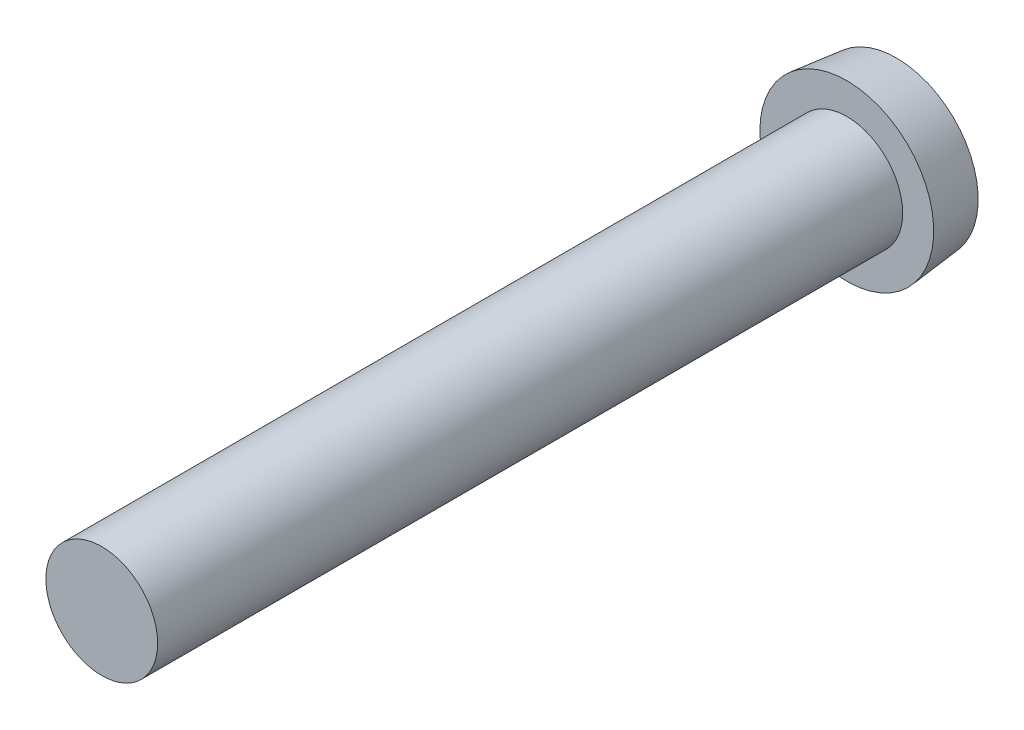
ISO-10303-21;
HEADER;
FILE_DESCRIPTION(('STEP AP214'),'2;1');
FILE_NAME('part.step','',(''),(''),'','','');
FILE_SCHEMA(('AUTOMOTIVE_DESIGN { 1 0 10303 214 1 1 1 1 }'));
ENDSEC;
DATA;
#1=APPLICATION_CONTEXT('core data for automotive mechanical design processes');
#2=APPLICATION_PROTOCOL_DEFINITION('international standard','automotive_design',2000,#1);
#3=PRODUCT_CONTEXT('',#1,'mechanical');
#4=PRODUCT('Part','Part','',(#3));
#5=PRODUCT_RELATED_PRODUCT_CATEGORY('part','',(#4));
#6=PRODUCT_DEFINITION_FORMATION('','',#4);
#7=PRODUCT_DEFINITION_CONTEXT('part definition',#1,'design');
#8=PRODUCT_DEFINITION('design','',#6,#7);
#9=PRODUCT_DEFINITION_SHAPE('','',#8);
#10=(LENGTH_UNIT() NAMED_UNIT(*) SI_UNIT(.MILLI.,.METRE.));
#11=(NAMED_UNIT(*) PLANE_ANGLE_UNIT() SI_UNIT($,.RADIAN.));
#12=(NAMED_UNIT(*) SI_UNIT($,.STERADIAN.) SOLID_ANGLE_UNIT());
#13=UNCERTAINTY_MEASURE_WITH_UNIT(LENGTH_MEASURE(1.E-05),#10,'distance_accuracy_value','');
#14=(GEOMETRIC_REPRESENTATION_CONTEXT(3) GLOBAL_UNCERTAINTY_ASSIGNED_CONTEXT((#13)) GLOBAL_UNIT_ASSIGNED_CONTEXT((#10,
#11,#12)) REPRESENTATION_CONTEXT('',''));
#15=CARTESIAN_POINT('',(0.,0.,0.));
#16=DIRECTION('',(0.,0.,1.));
#17=DIRECTION('',(1.,0.,0.));
#18=AXIS2_PLACEMENT_3D('',#15,#16,#17);
#19=CARTESIAN_POINT('',(0.,0.,30.));
#20=DIRECTION('',(0.,0.,-1.));
#21=DIRECTION('',(-1.,0.,0.));
#22=AXIS2_PLACEMENT_3D('',#19,#20,#21);
#23=CYLINDRICAL_SURFACE('',#22,2.25);
#24=CARTESIAN_POINT('',(0.,0.,30.));
#25=DIRECTION('',(0.,0.,1.));
#26=DIRECTION('',(1.,0.,0.));
#27=AXIS2_PLACEMENT_3D('',#24,#25,#26);
#28=CIRCLE('',#27,2.25);
#29=CARTESIAN_POINT('',(2.25,0.,30.));
#30=VERTEX_POINT('',#29);
#31=EDGE_CURVE('E11',#30,#30,#28,.T.);
#32=ORIENTED_EDGE('',*,*,#31,.F.);
#33=EDGE_LOOP('',(#32));
#34=FACE_BOUND('',#33,.T.);
#35=CARTESIAN_POINT('',(0.,0.,0.));
#36=DIRECTION('',(0.,0.,1.));
#37=DIRECTION('',(1.,0.,0.));
#38=AXIS2_PLACEMENT_3D('',#35,#36,#37);
#39=CIRCLE('',#38,2.25);
#40=CARTESIAN_POINT('',(2.25,0.,0.));
#41=VERTEX_POINT('',#40);
#42=EDGE_CURVE('E35',#41,#41,#39,.T.);
#43=ORIENTED_EDGE('',*,*,#42,.T.);
#44=EDGE_LOOP('',(#43));
#45=FACE_BOUND('',#44,.T.);
#46=ADVANCED_FACE('F32',(#34,#45),#23,.T.);
#47=CARTESIAN_POINT('',(0.,0.,30.));
#48=DIRECTION('',(0.,0.,1.));
#49=DIRECTION('',(1.,0.,0.));
#50=AXIS2_PLACEMENT_3D('',#47,#48,#49);
#51=PLANE('',#50);
#52=ORIENTED_EDGE('',*,*,#31,.T.);
#53=EDGE_LOOP('',(#52));
#54=FACE_BOUND('',#53,.T.);
#55=ADVANCED_FACE('F313',(#54),#51,.T.);
#56=CARTESIAN_POINT('',(0.,0.,0.));
#57=DIRECTION('',(0.,0.,1.));
#58=DIRECTION('',(-1.,0.,0.));
#59=AXIS2_PLACEMENT_3D('',#56,#57,#58);
#60=CONICAL_SURFACE('',#59,3.5,0.10471975511966);
#61=CARTESIAN_POINT('',(0.,0.,-2.));
#62=DIRECTION('',(0.,0.,-1.));
#63=DIRECTION('',(-1.,0.,0.));
#64=AXIS2_PLACEMENT_3D('',#61,#62,#63);
#65=CIRCLE('',#64,3.28979152946865);
#66=CARTESIAN_POINT('',(-3.28979152946865,0.,-2.));
#67=VERTEX_POINT('',#66);
#68=EDGE_CURVE('E295',#67,#67,#65,.T.);
#69=ORIENTED_EDGE('',*,*,#68,.F.);
#70=EDGE_LOOP('',(#69));
#71=FACE_BOUND('',#70,.T.);
#72=CARTESIAN_POINT('',(0.,0.,0.));
#73=DIRECTION('',(0.,0.,-1.));
#74=DIRECTION('',(-1.,0.,0.));
#75=AXIS2_PLACEMENT_3D('',#72,#73,#74);
#76=CIRCLE('',#75,3.5);
#77=CARTESIAN_POINT('',(-3.5,0.,0.));
#78=VERTEX_POINT('',#77);
#79=EDGE_CURVE('E259',#78,#78,#76,.T.);
#80=ORIENTED_EDGE('',*,*,#79,.T.);
#81=EDGE_LOOP('',(#80));
#82=FACE_BOUND('',#81,.T.);
#83=ADVANCED_FACE('F311',(#71,#82),#60,.T.);
#84=CARTESIAN_POINT('',(0.,0.,-2.));
#85=DIRECTION('',(0.,0.,-1.));
#86=DIRECTION('',(-1.,0.,0.));
#87=AXIS2_PLACEMENT_3D('',#84,#85,#86);
#88=PLANE('',#87);
#89=CARTESIAN_POINT('',(1.72197359249135,-0.2,-2.));
#90=DIRECTION('',(0.,0.,-1.));
#91=DIRECTION('',(-1.,0.,0.));
#92=AXIS2_PLACEMENT_3D('',#89,#90,#91);
#93=CIRCLE('',#92,0.2);
#94=CARTESIAN_POINT('',(1.92197359249135,-0.199999999999998,-2.));
#95=VERTEX_POINT('',#94);
#96=CARTESIAN_POINT('',(1.72197359249135,-0.4,-2.));
#97=VERTEX_POINT('',#96);
#98=EDGE_CURVE('E46',#95,#97,#93,.T.);
#99=ORIENTED_EDGE('',*,*,#98,.F.);
#100=DIRECTION('',(0.,-1.,0.));
#101=VECTOR('',#100,1.);
#102=CARTESIAN_POINT('',(1.92197359249135,0.199999999999999,-2.));
#103=LINE('',#102,#101);
#104=CARTESIAN_POINT('',(1.92197359249135,0.199999999999999,-2.));
#105=VERTEX_POINT('',#104);
#106=EDGE_CURVE('E255',#105,#95,#103,.T.);
#107=ORIENTED_EDGE('',*,*,#106,.F.);
#108=CARTESIAN_POINT('',(1.72197359249135,0.2,-2.));
#109=DIRECTION('',(0.,0.,-1.));
#110=DIRECTION('',(-1.,0.,0.));
#111=AXIS2_PLACEMENT_3D('',#108,#109,#110);
#112=CIRCLE('',#111,0.2);
#113=CARTESIAN_POINT('',(1.72197359249135,0.4,-2.));
#114=VERTEX_POINT('',#113);
#115=EDGE_CURVE('E253',#114,#105,#112,.T.);
#116=ORIENTED_EDGE('',*,*,#115,.F.);
#117=DIRECTION('',(1.,0.,0.));
#118=VECTOR('',#117,1.);
#119=CARTESIAN_POINT('',(1.72197359249135,0.4,-2.));
#120=LINE('',#119,#118);
#121=CARTESIAN_POINT('',(0.4,0.4,-2.));
#122=VERTEX_POINT('',#121);
#123=EDGE_CURVE('E178',#122,#114,#120,.T.);
#124=ORIENTED_EDGE('',*,*,#123,.F.);
#125=DIRECTION('',(0.,-1.,0.));
#126=VECTOR('',#125,1.);
#127=CARTESIAN_POINT('',(0.4,0.4,-2.));
#128=LINE('',#127,#126);
#129=CARTESIAN_POINT('',(0.4,3.06538333237671,-2.));
#130=VERTEX_POINT('',#129);
#131=EDGE_CURVE('E249',#130,#122,#128,.T.);
#132=ORIENTED_EDGE('',*,*,#131,.F.);
#133=CARTESIAN_POINT('',(0.2,3.06538333237671,-2.));
#134=DIRECTION('',(0.,0.,-1.));
#135=DIRECTION('',(-1.,0.,0.));
#136=AXIS2_PLACEMENT_3D('',#133,#134,#135);
#137=CIRCLE('',#136,0.2);
#138=CARTESIAN_POINT('',(0.199999999999999,3.26538333237671,-2.));
#139=VERTEX_POINT('',#138);
#140=EDGE_CURVE('E246',#139,#130,#137,.T.);
#141=ORIENTED_EDGE('',*,*,#140,.F.);
#142=DIRECTION('',(1.,0.,0.));
#143=VECTOR('',#142,1.);
#144=CARTESIAN_POINT('',(-0.199999999999999,3.26538333237671,-2.));
#145=LINE('',#144,#143);
#146=CARTESIAN_POINT('',(-0.199999999999999,3.26538333237671,-2.));
#147=VERTEX_POINT('',#146);
#148=EDGE_CURVE('E243',#147,#139,#145,.T.);
#149=ORIENTED_EDGE('',*,*,#148,.F.);
#150=CARTESIAN_POINT('',(-0.2,3.06538333237671,-2.));
#151=DIRECTION('',(0.,0.,-1.));
#152=DIRECTION('',(-1.,0.,0.));
#153=AXIS2_PLACEMENT_3D('',#150,#151,#152);
#154=CIRCLE('',#153,0.2);
#155=CARTESIAN_POINT('',(-0.4,3.06538333237671,-2.));
#156=VERTEX_POINT('',#155);
#157=EDGE_CURVE('E240',#156,#147,#154,.T.);
#158=ORIENTED_EDGE('',*,*,#157,.F.);
#159=DIRECTION('',(0.,1.,0.));
#160=VECTOR('',#159,1.);
#161=CARTESIAN_POINT('',(-0.4,0.4,-2.));
#162=LINE('',#161,#160);
#163=CARTESIAN_POINT('',(-0.4,0.4,-2.));
#164=VERTEX_POINT('',#163);
#165=EDGE_CURVE('E237',#164,#156,#162,.T.);
#166=ORIENTED_EDGE('',*,*,#165,.F.);
#167=DIRECTION('',(1.,0.,0.));
#168=VECTOR('',#167,1.);
#169=CARTESIAN_POINT('',(-0.4,0.4,-2.));
#170=LINE('',#169,#168);
#171=CARTESIAN_POINT('',(-1.72197359249135,0.4,-2.));
#172=VERTEX_POINT('',#171);
#173=EDGE_CURVE('E234',#172,#164,#170,.T.);
#174=ORIENTED_EDGE('',*,*,#173,.F.);
#175=CARTESIAN_POINT('',(-1.72197359249135,0.2,-2.));
#176=DIRECTION('',(0.,0.,-1.));
#177=DIRECTION('',(-1.,0.,0.));
#178=AXIS2_PLACEMENT_3D('',#175,#176,#177);
#179=CIRCLE('',#178,0.2);
#180=CARTESIAN_POINT('',(-1.92197359249135,0.199999999999999,-2.));
#181=VERTEX_POINT('',#180);
#182=EDGE_CURVE('E231',#181,#172,#179,.T.);
#183=ORIENTED_EDGE('',*,*,#182,.F.);
#184=DIRECTION('',(0.,1.,0.));
#185=VECTOR('',#184,1.);
#186=CARTESIAN_POINT('',(-1.92197359249135,0.199999999999999,-2.));
#187=LINE('',#186,#185);
#188=CARTESIAN_POINT('',(-1.92197359249135,-0.199999999999998,-2.));
#189=VERTEX_POINT('',#188);
#190=EDGE_CURVE('E228',#189,#181,#187,.T.);
#191=ORIENTED_EDGE('',*,*,#190,.F.);
#192=CARTESIAN_POINT('',(-1.72197359249135,-0.2,-2.));
#193=DIRECTION('',(0.,0.,-1.));
#194=DIRECTION('',(1.,0.,0.));
#195=AXIS2_PLACEMENT_3D('',#192,#193,#194);
#196=CIRCLE('',#195,0.2);
#197=CARTESIAN_POINT('',(-1.72197359249135,-0.4,-2.));
#198=VERTEX_POINT('',#197);
#199=EDGE_CURVE('E225',#198,#189,#196,.T.);
#200=ORIENTED_EDGE('',*,*,#199,.F.);
#201=DIRECTION('',(-1.,0.,0.));
#202=VECTOR('',#201,1.);
#203=CARTESIAN_POINT('',(-0.4,-0.4,-2.));
#204=LINE('',#203,#202);
#205=CARTESIAN_POINT('',(-0.4,-0.4,-2.));
#206=VERTEX_POINT('',#205);
#207=EDGE_CURVE('E222',#206,#198,#204,.T.);
#208=ORIENTED_EDGE('',*,*,#207,.F.);
#209=DIRECTION('',(0.,1.,0.));
#210=VECTOR('',#209,1.);
#211=CARTESIAN_POINT('',(-0.4,-3.06538333237671,-2.));
#212=LINE('',#211,#210);
#213=CARTESIAN_POINT('',(-0.4,-3.06538333237671,-2.));
#214=VERTEX_POINT('',#213);
#215=EDGE_CURVE('E219',#214,#206,#212,.T.);
#216=ORIENTED_EDGE('',*,*,#215,.F.);
#217=CARTESIAN_POINT('',(-0.2,-3.06538333237671,-2.));
#218=DIRECTION('',(0.,0.,-1.));
#219=DIRECTION('',(1.,0.,0.));
#220=AXIS2_PLACEMENT_3D('',#217,#218,#219);
#221=CIRCLE('',#220,0.2);
#222=CARTESIAN_POINT('',(-0.199999999999999,-3.26538333237671,-2.));
#223=VERTEX_POINT('',#222);
#224=EDGE_CURVE('E216',#223,#214,#221,.T.);
#225=ORIENTED_EDGE('',*,*,#224,.F.);
#226=DIRECTION('',(-1.,0.,0.));
#227=VECTOR('',#226,1.);
#228=CARTESIAN_POINT('',(-0.199999999999999,-3.26538333237671,-2.));
#229=LINE('',#228,#227);
#230=CARTESIAN_POINT('',(0.199999999999999,-3.26538333237671,-2.));
#231=VERTEX_POINT('',#230);
#232=EDGE_CURVE('E213',#231,#223,#229,.T.);
#233=ORIENTED_EDGE('',*,*,#232,.F.);
#234=CARTESIAN_POINT('',(0.2,-3.06538333237671,-2.));
#235=DIRECTION('',(0.,0.,-1.));
#236=DIRECTION('',(1.,0.,0.));
#237=AXIS2_PLACEMENT_3D('',#234,#235,#236);
#238=CIRCLE('',#237,0.2);
#239=CARTESIAN_POINT('',(0.4,-3.06538333237671,-2.));
#240=VERTEX_POINT('',#239);
#241=EDGE_CURVE('E210',#240,#231,#238,.T.);
#242=ORIENTED_EDGE('',*,*,#241,.F.);
#243=DIRECTION('',(0.,-1.,0.));
#244=VECTOR('',#243,1.);
#245=CARTESIAN_POINT('',(0.4,-3.06538333237671,-2.));
#246=LINE('',#245,#244);
#247=CARTESIAN_POINT('',(0.4,-0.4,-2.));
#248=VERTEX_POINT('',#247);
#249=EDGE_CURVE('E207',#248,#240,#246,.T.);
#250=ORIENTED_EDGE('',*,*,#249,.F.);
#251=DIRECTION('',(-1.,0.,0.));
#252=VECTOR('',#251,1.);
#253=CARTESIAN_POINT('',(1.72197359249135,-0.4,-2.));
#254=LINE('',#253,#252);
#255=EDGE_CURVE('E204',#97,#248,#254,.T.);
#256=ORIENTED_EDGE('',*,*,#255,.F.);
#257=EDGE_LOOP('',(#99,#107,#116,#124,#132,#141,#149,#158,#166,#174,#183,#191,#200,#208,#216,
#225,#233,#242,#250,#256));
#258=FACE_BOUND('',#257,.T.);
#259=ORIENTED_EDGE('',*,*,#68,.T.);
#260=EDGE_LOOP('',(#259));
#261=FACE_BOUND('',#260,.T.);
#262=ADVANCED_FACE('F307',(#258,#261),#88,.T.);
#263=CARTESIAN_POINT('',(0.,0.,0.));
#264=DIRECTION('',(0.,0.,-1.));
#265=DIRECTION('',(-1.,0.,0.));
#266=AXIS2_PLACEMENT_3D('',#263,#264,#265);
#267=PLANE('',#266);
#268=ORIENTED_EDGE('',*,*,#42,.F.);
#269=EDGE_LOOP('',(#268));
#270=FACE_BOUND('',#269,.T.);
#271=ORIENTED_EDGE('',*,*,#79,.F.);
#272=EDGE_LOOP('',(#271));
#273=FACE_BOUND('',#272,.T.);
#274=ADVANCED_FACE('F303',(#270,#273),#267,.F.);
#275=CARTESIAN_POINT('',(1.72197359249135,-0.2,-1.));
#276=DIRECTION('',(0.,0.,-1.));
#277=DIRECTION('',(-1.,0.,0.));
#278=AXIS2_PLACEMENT_3D('',#275,#276,#277);
#279=CYLINDRICAL_SURFACE('',#278,0.2);
#280=ORIENTED_EDGE('',*,*,#98,.T.);
#281=DIRECTION('',(0.,0.,-1.));
#282=VECTOR('',#281,1.);
#283=CARTESIAN_POINT('',(1.72197359249135,-0.4,-1.));
#284=LINE('',#283,#282);
#285=CARTESIAN_POINT('',(1.72197359249135,-0.4,-1.));
#286=VERTEX_POINT('',#285);
#287=EDGE_CURVE('E118',#286,#97,#284,.T.);
#288=ORIENTED_EDGE('',*,*,#287,.F.);
#289=CARTESIAN_POINT('',(1.72197359249135,-0.2,-1.));
#290=DIRECTION('',(0.,0.,-1.));
#291=DIRECTION('',(-1.,0.,0.));
#292=AXIS2_PLACEMENT_3D('',#289,#290,#291);
#293=CIRCLE('',#292,0.2);
#294=CARTESIAN_POINT('',(1.92197359249135,-0.199999999999998,-1.));
#295=VERTEX_POINT('',#294);
#296=EDGE_CURVE('E257',#295,#286,#293,.T.);
#297=ORIENTED_EDGE('',*,*,#296,.F.);
#298=DIRECTION('',(0.,0.,-1.));
#299=VECTOR('',#298,1.);
#300=CARTESIAN_POINT('',(1.92197359249135,-0.199999999999998,-1.));
#301=LINE('',#300,#299);
#302=EDGE_CURVE('E54',#295,#95,#301,.T.);
#303=ORIENTED_EDGE('',*,*,#302,.T.);
#304=EDGE_LOOP('',(#280,#288,#297,#303));
#305=FACE_BOUND('',#304,.T.);
#306=ADVANCED_FACE('F306',(#305),#279,.F.);
#307=CARTESIAN_POINT('',(1.92197359249135,0.199999999999999,-1.));
#308=DIRECTION('',(1.,0.,0.));
#309=DIRECTION('',(0.,0.,-1.));
#310=AXIS2_PLACEMENT_3D('',#307,#308,#309);
#311=PLANE('',#310);
#312=ORIENTED_EDGE('',*,*,#106,.T.);
#313=ORIENTED_EDGE('',*,*,#302,.F.);
#314=DIRECTION('',(0.,-1.,0.));
#315=VECTOR('',#314,1.);
#316=CARTESIAN_POINT('',(1.92197359249135,0.199999999999999,-1.));
#317=LINE('',#316,#315);
#318=CARTESIAN_POINT('',(1.92197359249135,0.199999999999999,-1.));
#319=VERTEX_POINT('',#318);
#320=EDGE_CURVE('E190',#319,#295,#317,.T.);
#321=ORIENTED_EDGE('',*,*,#320,.F.);
#322=DIRECTION('',(0.,0.,-1.));
#323=VECTOR('',#322,1.);
#324=CARTESIAN_POINT('',(1.92197359249135,0.199999999999999,-1.));
#325=LINE('',#324,#323);
#326=EDGE_CURVE('E182',#319,#105,#325,.T.);
#327=ORIENTED_EDGE('',*,*,#326,.T.);
#328=EDGE_LOOP('',(#312,#313,#321,#327));
#329=FACE_BOUND('',#328,.T.);
#330=ADVANCED_FACE('F357',(#329),#311,.F.);
#331=CARTESIAN_POINT('',(1.72197359249135,0.2,-1.));
#332=DIRECTION('',(0.,0.,-1.));
#333=DIRECTION('',(-1.,0.,0.));
#334=AXIS2_PLACEMENT_3D('',#331,#332,#333);
#335=CYLINDRICAL_SURFACE('',#334,0.2);
#336=ORIENTED_EDGE('',*,*,#115,.T.);
#337=ORIENTED_EDGE('',*,*,#326,.F.);
#338=CARTESIAN_POINT('',(1.72197359249135,0.2,-1.));
#339=DIRECTION('',(0.,0.,-1.));
#340=DIRECTION('',(-1.,0.,0.));
#341=AXIS2_PLACEMENT_3D('',#338,#339,#340);
#342=CIRCLE('',#341,0.2);
#343=CARTESIAN_POINT('',(1.72197359249135,0.4,-1.));
#344=VERTEX_POINT('',#343);
#345=EDGE_CURVE('E186',#344,#319,#342,.T.);
#346=ORIENTED_EDGE('',*,*,#345,.F.);
#347=DIRECTION('',(0.,0.,-1.));
#348=VECTOR('',#347,1.);
#349=CARTESIAN_POINT('',(1.72197359249135,0.4,-1.));
#350=LINE('',#349,#348);
#351=EDGE_CURVE('E171',#344,#114,#350,.T.);
#352=ORIENTED_EDGE('',*,*,#351,.T.);
#353=EDGE_LOOP('',(#336,#337,#346,#352));
#354=FACE_BOUND('',#353,.T.);
#355=ADVANCED_FACE('F187',(#354),#335,.F.);
#356=CARTESIAN_POINT('',(1.72197359249135,0.4,-1.));
#357=DIRECTION('',(0.,1.,0.));
#358=DIRECTION('',(0.,0.,1.));
#359=AXIS2_PLACEMENT_3D('',#356,#357,#358);
#360=PLANE('',#359);
#361=ORIENTED_EDGE('',*,*,#123,.T.);
#362=ORIENTED_EDGE('',*,*,#351,.F.);
#363=DIRECTION('',(1.,0.,0.));
#364=VECTOR('',#363,1.);
#365=CARTESIAN_POINT('',(1.72197359249135,0.4,-1.));
#366=LINE('',#365,#364);
#367=CARTESIAN_POINT('',(0.4,0.4,-1.));
#368=VERTEX_POINT('',#367);
#369=EDGE_CURVE('E175',#368,#344,#366,.T.);
#370=ORIENTED_EDGE('',*,*,#369,.F.);
#371=DIRECTION('',(0.,0.,-1.));
#372=VECTOR('',#371,1.);
#373=CARTESIAN_POINT('',(0.4,0.4,-1.));
#374=LINE('',#373,#372);
#375=EDGE_CURVE('E183',#368,#122,#374,.T.);
#376=ORIENTED_EDGE('',*,*,#375,.T.);
#377=EDGE_LOOP('',(#361,#362,#370,#376));
#378=FACE_BOUND('',#377,.T.);
#379=ADVANCED_FACE('F173',(#378),#360,.F.);
#380=CARTESIAN_POINT('',(0.4,0.4,-1.));
#381=DIRECTION('',(1.,0.,0.));
#382=DIRECTION('',(0.,1.,0.));
#383=AXIS2_PLACEMENT_3D('',#380,#381,#382);
#384=PLANE('',#383);
#385=ORIENTED_EDGE('',*,*,#131,.T.);
#386=ORIENTED_EDGE('',*,*,#375,.F.);
#387=DIRECTION('',(0.,-1.,0.));
#388=VECTOR('',#387,1.);
#389=CARTESIAN_POINT('',(0.4,0.4,-1.));
#390=LINE('',#389,#388);
#391=CARTESIAN_POINT('',(0.4,3.06538333237671,-1.));
#392=VERTEX_POINT('',#391);
#393=EDGE_CURVE('E196',#392,#368,#390,.T.);
#394=ORIENTED_EDGE('',*,*,#393,.F.);
#395=DIRECTION('',(0.,0.,-1.));
#396=VECTOR('',#395,1.);
#397=CARTESIAN_POINT('',(0.4,3.06538333237671,-1.));
#398=LINE('',#397,#396);
#399=EDGE_CURVE('E262',#392,#130,#398,.T.);
#400=ORIENTED_EDGE('',*,*,#399,.T.);
#401=EDGE_LOOP('',(#385,#386,#394,#400));
#402=FACE_BOUND('',#401,.T.);
#403=ADVANCED_FACE('F382',(#402),#384,.F.);
#404=CARTESIAN_POINT('',(0.2,3.06538333237671,-1.));
#405=DIRECTION('',(0.,0.,-1.));
#406=DIRECTION('',(-1.,0.,0.));
#407=AXIS2_PLACEMENT_3D('',#404,#405,#406);
#408=CYLINDRICAL_SURFACE('',#407,0.2);
#409=ORIENTED_EDGE('',*,*,#140,.T.);
#410=ORIENTED_EDGE('',*,*,#399,.F.);
#411=CARTESIAN_POINT('',(0.2,3.06538333237671,-1.));
#412=DIRECTION('',(0.,0.,-1.));
#413=DIRECTION('',(-1.,0.,0.));
#414=AXIS2_PLACEMENT_3D('',#411,#412,#413);
#415=CIRCLE('',#414,0.2);
#416=CARTESIAN_POINT('',(0.199999999999999,3.26538333237671,-1.));
#417=VERTEX_POINT('',#416);
#418=EDGE_CURVE('E198',#417,#392,#415,.T.);
#419=ORIENTED_EDGE('',*,*,#418,.F.);
#420=DIRECTION('',(0.,0.,-1.));
#421=VECTOR('',#420,1.);
#422=CARTESIAN_POINT('',(0.199999999999999,3.26538333237671,-1.));
#423=LINE('',#422,#421);
#424=EDGE_CURVE('E264',#417,#139,#423,.T.);
#425=ORIENTED_EDGE('',*,*,#424,.T.);
#426=EDGE_LOOP('',(#409,#410,#419,#425));
#427=FACE_BOUND('',#426,.T.);
#428=ADVANCED_FACE('F391',(#427),#408,.F.);
#429=CARTESIAN_POINT('',(-0.199999999999999,3.26538333237671,-1.));
#430=DIRECTION('',(0.,1.,0.));
#431=DIRECTION('',(0.,0.,1.));
#432=AXIS2_PLACEMENT_3D('',#429,#430,#431);
#433=PLANE('',#432);
#434=ORIENTED_EDGE('',*,*,#148,.T.);
#435=ORIENTED_EDGE('',*,*,#424,.F.);
#436=DIRECTION('',(1.,0.,0.));
#437=VECTOR('',#436,1.);
#438=CARTESIAN_POINT('',(-0.199999999999999,3.26538333237671,-1.));
#439=LINE('',#438,#437);
#440=CARTESIAN_POINT('',(-0.199999999999999,3.26538333237671,-1.));
#441=VERTEX_POINT('',#440);
#442=EDGE_CURVE('E600',#441,#417,#439,.T.);
#443=ORIENTED_EDGE('',*,*,#442,.F.);
#444=DIRECTION('',(0.,0.,-1.));
#445=VECTOR('',#444,1.);
#446=CARTESIAN_POINT('',(-0.199999999999999,3.26538333237671,-1.));
#447=LINE('',#446,#445);
#448=EDGE_CURVE('E266',#441,#147,#447,.T.);
#449=ORIENTED_EDGE('',*,*,#448,.T.);
#450=EDGE_LOOP('',(#434,#435,#443,#449));
#451=FACE_BOUND('',#450,.T.);
#452=ADVANCED_FACE('F401',(#451),#433,.F.);
#453=CARTESIAN_POINT('',(-0.2,3.06538333237671,-1.));
#454=DIRECTION('',(0.,0.,-1.));
#455=DIRECTION('',(-1.,0.,0.));
#456=AXIS2_PLACEMENT_3D('',#453,#454,#455);
#457=CYLINDRICAL_SURFACE('',#456,0.2);
#458=ORIENTED_EDGE('',*,*,#157,.T.);
#459=ORIENTED_EDGE('',*,*,#448,.F.);
#460=CARTESIAN_POINT('',(-0.2,3.06538333237671,-1.));
#461=DIRECTION('',(0.,0.,-1.));
#462=DIRECTION('',(-1.,0.,0.));
#463=AXIS2_PLACEMENT_3D('',#460,#461,#462);
#464=CIRCLE('',#463,0.2);
#465=CARTESIAN_POINT('',(-0.4,3.06538333237671,-1.));
#466=VERTEX_POINT('',#465);
#467=EDGE_CURVE('E597',#466,#441,#464,.T.);
#468=ORIENTED_EDGE('',*,*,#467,.F.);
#469=DIRECTION('',(0.,0.,-1.));
#470=VECTOR('',#469,1.);
#471=CARTESIAN_POINT('',(-0.4,3.06538333237671,-1.));
#472=LINE('',#471,#470);
#473=EDGE_CURVE('E268',#466,#156,#472,.T.);
#474=ORIENTED_EDGE('',*,*,#473,.T.);
#475=EDGE_LOOP('',(#458,#459,#468,#474));
#476=FACE_BOUND('',#475,.T.);
#477=ADVANCED_FACE('F411',(#476),#457,.F.);
#478=CARTESIAN_POINT('',(-0.4,0.4,-1.));
#479=DIRECTION('',(-1.,0.,0.));
#480=DIRECTION('',(0.,0.,1.));
#481=AXIS2_PLACEMENT_3D('',#478,#479,#480);
#482=PLANE('',#481);
#483=ORIENTED_EDGE('',*,*,#165,.T.);
#484=ORIENTED_EDGE('',*,*,#473,.F.);
#485=DIRECTION('',(0.,1.,0.));
#486=VECTOR('',#485,1.);
#487=CARTESIAN_POINT('',(-0.4,0.4,-1.));
#488=LINE('',#487,#486);
#489=CARTESIAN_POINT('',(-0.4,0.4,-1.));
#490=VERTEX_POINT('',#489);
#491=EDGE_CURVE('E594',#490,#466,#488,.T.);
#492=ORIENTED_EDGE('',*,*,#491,.F.);
#493=DIRECTION('',(0.,0.,-1.));
#494=VECTOR('',#493,1.);
#495=CARTESIAN_POINT('',(-0.4,0.4,-1.));
#496=LINE('',#495,#494);
#497=EDGE_CURVE('E270',#490,#164,#496,.T.);
#498=ORIENTED_EDGE('',*,*,#497,.T.);
#499=EDGE_LOOP('',(#483,#484,#492,#498));
#500=FACE_BOUND('',#499,.T.);
#501=ADVANCED_FACE('F421',(#500),#482,.F.);
#502=CARTESIAN_POINT('',(-0.4,0.4,-1.));
#503=DIRECTION('',(0.,1.,0.));
#504=DIRECTION('',(-1.,0.,0.));
#505=AXIS2_PLACEMENT_3D('',#502,#503,#504);
#506=PLANE('',#505);
#507=ORIENTED_EDGE('',*,*,#173,.T.);
#508=ORIENTED_EDGE('',*,*,#497,.F.);
#509=DIRECTION('',(1.,0.,0.));
#510=VECTOR('',#509,1.);
#511=CARTESIAN_POINT('',(-0.4,0.4,-1.));
#512=LINE('',#511,#510);
#513=CARTESIAN_POINT('',(-1.72197359249135,0.4,-1.));
#514=VERTEX_POINT('',#513);
#515=EDGE_CURVE('E591',#514,#490,#512,.T.);
#516=ORIENTED_EDGE('',*,*,#515,.F.);
#517=DIRECTION('',(0.,0.,-1.));
#518=VECTOR('',#517,1.);
#519=CARTESIAN_POINT('',(-1.72197359249135,0.4,-1.));
#520=LINE('',#519,#518);
#521=EDGE_CURVE('E272',#514,#172,#520,.T.);
#522=ORIENTED_EDGE('',*,*,#521,.T.);
#523=EDGE_LOOP('',(#507,#508,#516,#522));
#524=FACE_BOUND('',#523,.T.);
#525=ADVANCED_FACE('F431',(#524),#506,.F.);
#526=CARTESIAN_POINT('',(-1.72197359249135,0.2,-1.));
#527=DIRECTION('',(0.,0.,-1.));
#528=DIRECTION('',(-1.,0.,0.));
#529=AXIS2_PLACEMENT_3D('',#526,#527,#528);
#530=CYLINDRICAL_SURFACE('',#529,0.2);
#531=ORIENTED_EDGE('',*,*,#182,.T.);
#532=ORIENTED_EDGE('',*,*,#521,.F.);
#533=CARTESIAN_POINT('',(-1.72197359249135,0.2,-1.));
#534=DIRECTION('',(0.,0.,-1.));
#535=DIRECTION('',(-1.,0.,0.));
#536=AXIS2_PLACEMENT_3D('',#533,#534,#535);
#537=CIRCLE('',#536,0.2);
#538=CARTESIAN_POINT('',(-1.92197359249135,0.199999999999999,-1.));
#539=VERTEX_POINT('',#538);
#540=EDGE_CURVE('E588',#539,#514,#537,.T.);
#541=ORIENTED_EDGE('',*,*,#540,.F.);
#542=DIRECTION('',(0.,0.,-1.));
#543=VECTOR('',#542,1.);
#544=CARTESIAN_POINT('',(-1.92197359249135,0.199999999999999,-1.));
#545=LINE('',#544,#543);
#546=EDGE_CURVE('E274',#539,#181,#545,.T.);
#547=ORIENTED_EDGE('',*,*,#546,.T.);
#548=EDGE_LOOP('',(#531,#532,#541,#547));
#549=FACE_BOUND('',#548,.T.);
#550=ADVANCED_FACE('F441',(#549),#530,.F.);
#551=CARTESIAN_POINT('',(-1.92197359249135,0.199999999999999,-1.));
#552=DIRECTION('',(-1.,0.,0.));
#553=DIRECTION('',(0.,0.,1.));
#554=AXIS2_PLACEMENT_3D('',#551,#552,#553);
#555=PLANE('',#554);
#556=ORIENTED_EDGE('',*,*,#190,.T.);
#557=ORIENTED_EDGE('',*,*,#546,.F.);
#558=DIRECTION('',(0.,1.,0.));
#559=VECTOR('',#558,1.);
#560=CARTESIAN_POINT('',(-1.92197359249135,0.199999999999999,-1.));
#561=LINE('',#560,#559);
#562=CARTESIAN_POINT('',(-1.92197359249135,-0.199999999999998,-1.));
#563=VERTEX_POINT('',#562);
#564=EDGE_CURVE('E585',#563,#539,#561,.T.);
#565=ORIENTED_EDGE('',*,*,#564,.F.);
#566=DIRECTION('',(0.,0.,-1.));
#567=VECTOR('',#566,1.);
#568=CARTESIAN_POINT('',(-1.92197359249135,-0.199999999999998,-1.));
#569=LINE('',#568,#567);
#570=EDGE_CURVE('E276',#563,#189,#569,.T.);
#571=ORIENTED_EDGE('',*,*,#570,.T.);
#572=EDGE_LOOP('',(#556,#557,#565,#571));
#573=FACE_BOUND('',#572,.T.);
#574=ADVANCED_FACE('F451',(#573),#555,.F.);
#575=CARTESIAN_POINT('',(-1.72197359249135,-0.2,-1.));
#576=DIRECTION('',(0.,0.,-1.));
#577=DIRECTION('',(-1.,0.,0.));
#578=AXIS2_PLACEMENT_3D('',#575,#576,#577);
#579=CYLINDRICAL_SURFACE('',#578,0.2);
#580=ORIENTED_EDGE('',*,*,#199,.T.);
#581=ORIENTED_EDGE('',*,*,#570,.F.);
#582=CARTESIAN_POINT('',(-1.72197359249135,-0.2,-1.));
#583=DIRECTION('',(0.,0.,-1.));
#584=DIRECTION('',(1.,0.,0.));
#585=AXIS2_PLACEMENT_3D('',#582,#583,#584);
#586=CIRCLE('',#585,0.2);
#587=CARTESIAN_POINT('',(-1.72197359249135,-0.4,-1.));
#588=VERTEX_POINT('',#587);
#589=EDGE_CURVE('E582',#588,#563,#586,.T.);
#590=ORIENTED_EDGE('',*,*,#589,.F.);
#591=DIRECTION('',(0.,0.,-1.));
#592=VECTOR('',#591,1.);
#593=CARTESIAN_POINT('',(-1.72197359249135,-0.4,-1.));
#594=LINE('',#593,#592);
#595=EDGE_CURVE('E278',#588,#198,#594,.T.);
#596=ORIENTED_EDGE('',*,*,#595,.T.);
#597=EDGE_LOOP('',(#580,#581,#590,#596));
#598=FACE_BOUND('',#597,.T.);
#599=ADVANCED_FACE('F461',(#598),#579,.F.);
#600=CARTESIAN_POINT('',(-0.4,-0.4,-1.));
#601=DIRECTION('',(0.,-1.,0.));
#602=DIRECTION('',(1.,0.,0.));
#603=AXIS2_PLACEMENT_3D('',#600,#601,#602);
#604=PLANE('',#603);
#605=ORIENTED_EDGE('',*,*,#207,.T.);
#606=ORIENTED_EDGE('',*,*,#595,.F.);
#607=DIRECTION('',(-1.,0.,0.));
#608=VECTOR('',#607,1.);
#609=CARTESIAN_POINT('',(-0.4,-0.4,-1.));
#610=LINE('',#609,#608);
#611=CARTESIAN_POINT('',(-0.4,-0.4,-1.));
#612=VERTEX_POINT('',#611);
#613=EDGE_CURVE('E579',#612,#588,#610,.T.);
#614=ORIENTED_EDGE('',*,*,#613,.F.);
#615=DIRECTION('',(0.,0.,-1.));
#616=VECTOR('',#615,1.);
#617=CARTESIAN_POINT('',(-0.4,-0.4,-1.));
#618=LINE('',#617,#616);
#619=EDGE_CURVE('E280',#612,#206,#618,.T.);
#620=ORIENTED_EDGE('',*,*,#619,.T.);
#621=EDGE_LOOP('',(#605,#606,#614,#620));
#622=FACE_BOUND('',#621,.T.);
#623=ADVANCED_FACE('F471',(#622),#604,.F.);
#624=CARTESIAN_POINT('',(-0.4,-3.06538333237671,-1.));
#625=DIRECTION('',(-1.,0.,0.));
#626=DIRECTION('',(0.,-1.,0.));
#627=AXIS2_PLACEMENT_3D('',#624,#625,#626);
#628=PLANE('',#627);
#629=ORIENTED_EDGE('',*,*,#215,.T.);
#630=ORIENTED_EDGE('',*,*,#619,.F.);
#631=DIRECTION('',(0.,1.,0.));
#632=VECTOR('',#631,1.);
#633=CARTESIAN_POINT('',(-0.4,-3.06538333237671,-1.));
#634=LINE('',#633,#632);
#635=CARTESIAN_POINT('',(-0.4,-3.06538333237671,-1.));
#636=VERTEX_POINT('',#635);
#637=EDGE_CURVE('E576',#636,#612,#634,.T.);
#638=ORIENTED_EDGE('',*,*,#637,.F.);
#639=DIRECTION('',(0.,0.,-1.));
#640=VECTOR('',#639,1.);
#641=CARTESIAN_POINT('',(-0.4,-3.06538333237671,-1.));
#642=LINE('',#641,#640);
#643=EDGE_CURVE('E282',#636,#214,#642,.T.);
#644=ORIENTED_EDGE('',*,*,#643,.T.);
#645=EDGE_LOOP('',(#629,#630,#638,#644));
#646=FACE_BOUND('',#645,.T.);
#647=ADVANCED_FACE('F481',(#646),#628,.F.);
#648=CARTESIAN_POINT('',(-0.2,-3.06538333237671,-1.));
#649=DIRECTION('',(0.,0.,-1.));
#650=DIRECTION('',(-1.,0.,0.));
#651=AXIS2_PLACEMENT_3D('',#648,#649,#650);
#652=CYLINDRICAL_SURFACE('',#651,0.2);
#653=ORIENTED_EDGE('',*,*,#224,.T.);
#654=ORIENTED_EDGE('',*,*,#643,.F.);
#655=CARTESIAN_POINT('',(-0.2,-3.06538333237671,-1.));
#656=DIRECTION('',(0.,0.,-1.));
#657=DIRECTION('',(1.,0.,0.));
#658=AXIS2_PLACEMENT_3D('',#655,#656,#657);
#659=CIRCLE('',#658,0.2);
#660=CARTESIAN_POINT('',(-0.199999999999999,-3.26538333237671,-1.));
#661=VERTEX_POINT('',#660);
#662=EDGE_CURVE('E573',#661,#636,#659,.T.);
#663=ORIENTED_EDGE('',*,*,#662,.F.);
#664=DIRECTION('',(0.,0.,-1.));
#665=VECTOR('',#664,1.);
#666=CARTESIAN_POINT('',(-0.199999999999999,-3.26538333237671,-1.));
#667=LINE('',#666,#665);
#668=EDGE_CURVE('E284',#661,#223,#667,.T.);
#669=ORIENTED_EDGE('',*,*,#668,.T.);
#670=EDGE_LOOP('',(#653,#654,#663,#669));
#671=FACE_BOUND('',#670,.T.);
#672=ADVANCED_FACE('F491',(#671),#652,.F.);
#673=CARTESIAN_POINT('',(-0.199999999999999,-3.26538333237671,-1.));
#674=DIRECTION('',(0.,-1.,0.));
#675=DIRECTION('',(0.,0.,-1.));
#676=AXIS2_PLACEMENT_3D('',#673,#674,#675);
#677=PLANE('',#676);
#678=ORIENTED_EDGE('',*,*,#232,.T.);
#679=ORIENTED_EDGE('',*,*,#668,.F.);
#680=DIRECTION('',(-1.,0.,0.));
#681=VECTOR('',#680,1.);
#682=CARTESIAN_POINT('',(-0.199999999999999,-3.26538333237671,-1.));
#683=LINE('',#682,#681);
#684=CARTESIAN_POINT('',(0.199999999999999,-3.26538333237671,-1.));
#685=VERTEX_POINT('',#684);
#686=EDGE_CURVE('E570',#685,#661,#683,.T.);
#687=ORIENTED_EDGE('',*,*,#686,.F.);
#688=DIRECTION('',(0.,0.,-1.));
#689=VECTOR('',#688,1.);
#690=CARTESIAN_POINT('',(0.199999999999999,-3.26538333237671,-1.));
#691=LINE('',#690,#689);
#692=EDGE_CURVE('E286',#685,#231,#691,.T.);
#693=ORIENTED_EDGE('',*,*,#692,.T.);
#694=EDGE_LOOP('',(#678,#679,#687,#693));
#695=FACE_BOUND('',#694,.T.);
#696=ADVANCED_FACE('F501',(#695),#677,.F.);
#697=CARTESIAN_POINT('',(0.2,-3.06538333237671,-1.));
#698=DIRECTION('',(0.,0.,-1.));
#699=DIRECTION('',(-1.,0.,0.));
#700=AXIS2_PLACEMENT_3D('',#697,#698,#699);
#701=CYLINDRICAL_SURFACE('',#700,0.2);
#702=ORIENTED_EDGE('',*,*,#241,.T.);
#703=ORIENTED_EDGE('',*,*,#692,.F.);
#704=CARTESIAN_POINT('',(0.2,-3.06538333237671,-1.));
#705=DIRECTION('',(0.,0.,-1.));
#706=DIRECTION('',(1.,0.,0.));
#707=AXIS2_PLACEMENT_3D('',#704,#705,#706);
#708=CIRCLE('',#707,0.2);
#709=CARTESIAN_POINT('',(0.4,-3.06538333237671,-1.));
#710=VERTEX_POINT('',#709);
#711=EDGE_CURVE('E563',#710,#685,#708,.T.);
#712=ORIENTED_EDGE('',*,*,#711,.F.);
#713=DIRECTION('',(0.,0.,-1.));
#714=VECTOR('',#713,1.);
#715=CARTESIAN_POINT('',(0.4,-3.06538333237671,-1.));
#716=LINE('',#715,#714);
#717=EDGE_CURVE('E288',#710,#240,#716,.T.);
#718=ORIENTED_EDGE('',*,*,#717,.T.);
#719=EDGE_LOOP('',(#702,#703,#712,#718));
#720=FACE_BOUND('',#719,.T.);
#721=ADVANCED_FACE('F511',(#720),#701,.F.);
#722=CARTESIAN_POINT('',(0.4,-3.06538333237671,-1.));
#723=DIRECTION('',(1.,0.,0.));
#724=DIRECTION('',(0.,1.,0.));
#725=AXIS2_PLACEMENT_3D('',#722,#723,#724);
#726=PLANE('',#725);
#727=ORIENTED_EDGE('',*,*,#249,.T.);
#728=ORIENTED_EDGE('',*,*,#717,.F.);
#729=DIRECTION('',(0.,-1.,0.));
#730=VECTOR('',#729,1.);
#731=CARTESIAN_POINT('',(0.4,-3.06538333237671,-1.));
#732=LINE('',#731,#730);
#733=CARTESIAN_POINT('',(0.4,-0.4,-1.));
#734=VERTEX_POINT('',#733);
#735=EDGE_CURVE('E560',#734,#710,#732,.T.);
#736=ORIENTED_EDGE('',*,*,#735,.F.);
#737=DIRECTION('',(0.,0.,-1.));
#738=VECTOR('',#737,1.);
#739=CARTESIAN_POINT('',(0.4,-0.4,-1.));
#740=LINE('',#739,#738);
#741=EDGE_CURVE('E290',#734,#248,#740,.T.);
#742=ORIENTED_EDGE('',*,*,#741,.T.);
#743=EDGE_LOOP('',(#727,#728,#736,#742));
#744=FACE_BOUND('',#743,.T.);
#745=ADVANCED_FACE('F521',(#744),#726,.F.);
#746=CARTESIAN_POINT('',(1.72197359249135,-0.4,-1.));
#747=DIRECTION('',(0.,-1.,0.));
#748=DIRECTION('',(1.,0.,0.));
#749=AXIS2_PLACEMENT_3D('',#746,#747,#748);
#750=PLANE('',#749);
#751=ORIENTED_EDGE('',*,*,#255,.T.);
#752=ORIENTED_EDGE('',*,*,#741,.F.);
#753=DIRECTION('',(-1.,0.,0.));
#754=VECTOR('',#753,1.);
#755=CARTESIAN_POINT('',(1.72197359249135,-0.4,-1.));
#756=LINE('',#755,#754);
#757=EDGE_CURVE('E564',#286,#734,#756,.T.);
#758=ORIENTED_EDGE('',*,*,#757,.F.);
#759=ORIENTED_EDGE('',*,*,#287,.T.);
#760=EDGE_LOOP('',(#751,#752,#758,#759));
#761=FACE_BOUND('',#760,.T.);
#762=ADVANCED_FACE('F531',(#761),#750,.F.);
#763=CARTESIAN_POINT('',(1.72197359249135,-0.2,-1.));
#764=DIRECTION('',(0.,0.,-1.));
#765=DIRECTION('',(-1.,0.,0.));
#766=AXIS2_PLACEMENT_3D('',#763,#764,#765);
#767=PLANE('',#766);
#768=ORIENTED_EDGE('',*,*,#296,.T.);
#769=ORIENTED_EDGE('',*,*,#757,.T.);
#770=ORIENTED_EDGE('',*,*,#735,.T.);
#771=ORIENTED_EDGE('',*,*,#711,.T.);
#772=ORIENTED_EDGE('',*,*,#686,.T.);
#773=ORIENTED_EDGE('',*,*,#662,.T.);
#774=ORIENTED_EDGE('',*,*,#637,.T.);
#775=ORIENTED_EDGE('',*,*,#613,.T.);
#776=ORIENTED_EDGE('',*,*,#589,.T.);
#777=ORIENTED_EDGE('',*,*,#564,.T.);
#778=ORIENTED_EDGE('',*,*,#540,.T.);
#779=ORIENTED_EDGE('',*,*,#515,.T.);
#780=ORIENTED_EDGE('',*,*,#491,.T.);
#781=ORIENTED_EDGE('',*,*,#467,.T.);
#782=ORIENTED_EDGE('',*,*,#442,.T.);
#783=ORIENTED_EDGE('',*,*,#418,.T.);
#784=ORIENTED_EDGE('',*,*,#393,.T.);
#785=ORIENTED_EDGE('',*,*,#369,.T.);
#786=ORIENTED_EDGE('',*,*,#345,.T.);
#787=ORIENTED_EDGE('',*,*,#320,.T.);
#788=EDGE_LOOP('',(#768,#769,#770,#771,#772,#773,#774,#775,#776,#777,#778,#779,#780,#781,#782,
#783,#784,#785,#786,#787));
#789=FACE_BOUND('',#788,.T.);
#790=ADVANCED_FACE('F193',(#789),#767,.T.);
#791=CLOSED_SHELL('',(#46,#55,#83,#262,#274,#306,#330,#355,#379,#403,#428,#452,#477,#501,#525,
#550,#574,#599,#623,#647,#672,#696,#721,#745,#762,#790));
#792=MANIFOLD_SOLID_BREP('B2',#791);
#793=ADVANCED_BREP_SHAPE_REPRESENTATION('',(#18,#792),#14);
#794=SHAPE_DEFINITION_REPRESENTATION(#9,#793);
ENDSEC;
END-ISO-10303-21;
